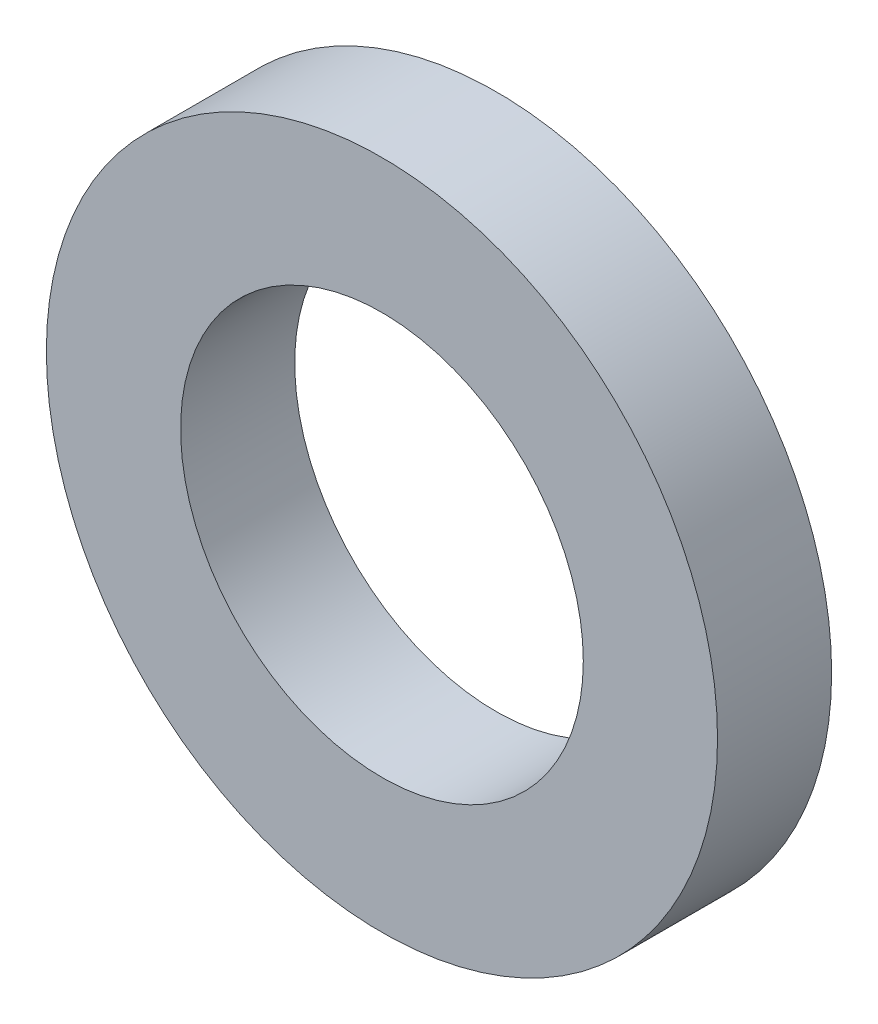
ISO-10303-21;
HEADER;
FILE_DESCRIPTION(('STEP AP214'),'2;1');
FILE_NAME('part.step','',(''),(''),'','','');
FILE_SCHEMA(('AUTOMOTIVE_DESIGN { 1 0 10303 214 1 1 1 1 }'));
ENDSEC;
DATA;
#1=APPLICATION_CONTEXT('core data for automotive mechanical design processes');
#2=APPLICATION_PROTOCOL_DEFINITION('international standard','automotive_design',2000,#1);
#3=PRODUCT_CONTEXT('',#1,'mechanical');
#4=PRODUCT('Part','Part','',(#3));
#5=PRODUCT_RELATED_PRODUCT_CATEGORY('part','',(#4));
#6=PRODUCT_DEFINITION_FORMATION('','',#4);
#7=PRODUCT_DEFINITION_CONTEXT('part definition',#1,'design');
#8=PRODUCT_DEFINITION('design','',#6,#7);
#9=PRODUCT_DEFINITION_SHAPE('','',#8);
#10=(LENGTH_UNIT() NAMED_UNIT(*) SI_UNIT(.MILLI.,.METRE.));
#11=(NAMED_UNIT(*) PLANE_ANGLE_UNIT() SI_UNIT($,.RADIAN.));
#12=(NAMED_UNIT(*) SI_UNIT($,.STERADIAN.) SOLID_ANGLE_UNIT());
#13=UNCERTAINTY_MEASURE_WITH_UNIT(LENGTH_MEASURE(1.E-05),#10,'distance_accuracy_value','');
#14=(GEOMETRIC_REPRESENTATION_CONTEXT(3) GLOBAL_UNCERTAINTY_ASSIGNED_CONTEXT((#13)) GLOBAL_UNIT_ASSIGNED_CONTEXT((#10,
#11,#12)) REPRESENTATION_CONTEXT('',''));
#15=CARTESIAN_POINT('',(0.,0.,0.));
#16=DIRECTION('',(0.,0.,1.));
#17=DIRECTION('',(1.,0.,0.));
#18=AXIS2_PLACEMENT_3D('',#15,#16,#17);
#19=CARTESIAN_POINT('',(0.,0.,1.7));
#20=DIRECTION('',(0.,0.,1.));
#21=DIRECTION('',(1.,0.,0.));
#22=AXIS2_PLACEMENT_3D('',#19,#20,#21);
#23=PLANE('',#22);
#24=CARTESIAN_POINT('',(0.,0.,1.7));
#25=DIRECTION('',(0.,0.,1.));
#26=DIRECTION('',(1.,0.,0.));
#27=AXIS2_PLACEMENT_3D('',#24,#25,#26);
#28=CIRCLE('',#27,5.);
#29=CARTESIAN_POINT('',(5.,0.,1.7));
#30=VERTEX_POINT('',#29);
#31=EDGE_CURVE('E10',#30,#30,#28,.T.);
#32=ORIENTED_EDGE('',*,*,#31,.T.);
#33=EDGE_LOOP('',(#32));
#34=FACE_BOUND('',#33,.T.);
#35=CARTESIAN_POINT('',(0.,0.,1.7));
#36=DIRECTION('',(0.,0.,1.));
#37=DIRECTION('',(1.,0.,0.));
#38=AXIS2_PLACEMENT_3D('',#35,#36,#37);
#39=CIRCLE('',#38,3.);
#40=CARTESIAN_POINT('',(3.,0.,1.7));
#41=VERTEX_POINT('',#40);
#42=EDGE_CURVE('E42',#41,#41,#39,.T.);
#43=ORIENTED_EDGE('',*,*,#42,.F.);
#44=EDGE_LOOP('',(#43));
#45=FACE_BOUND('',#44,.T.);
#46=ADVANCED_FACE('F31',(#34,#45),#23,.T.);
#47=CARTESIAN_POINT('',(0.,0.,0.));
#48=DIRECTION('',(0.,0.,1.));
#49=DIRECTION('',(1.,0.,0.));
#50=AXIS2_PLACEMENT_3D('',#47,#48,#49);
#51=PLANE('',#50);
#52=CARTESIAN_POINT('',(0.,0.,0.));
#53=DIRECTION('',(0.,0.,1.));
#54=DIRECTION('',(1.,0.,0.));
#55=AXIS2_PLACEMENT_3D('',#52,#53,#54);
#56=CIRCLE('',#55,5.);
#57=CARTESIAN_POINT('',(5.,0.,0.));
#58=VERTEX_POINT('',#57);
#59=EDGE_CURVE('E35',#58,#58,#56,.T.);
#60=ORIENTED_EDGE('',*,*,#59,.F.);
#61=EDGE_LOOP('',(#60));
#62=FACE_BOUND('',#61,.T.);
#63=CARTESIAN_POINT('',(0.,0.,0.));
#64=DIRECTION('',(0.,0.,1.));
#65=DIRECTION('',(1.,0.,0.));
#66=AXIS2_PLACEMENT_3D('',#63,#64,#65);
#67=CIRCLE('',#66,3.);
#68=CARTESIAN_POINT('',(3.,0.,0.));
#69=VERTEX_POINT('',#68);
#70=EDGE_CURVE('E44',#69,#69,#67,.T.);
#71=ORIENTED_EDGE('',*,*,#70,.T.);
#72=EDGE_LOOP('',(#71));
#73=FACE_BOUND('',#72,.T.);
#74=ADVANCED_FACE('F54',(#62,#73),#51,.F.);
#75=CARTESIAN_POINT('',(0.,0.,1.7));
#76=DIRECTION('',(0.,0.,-1.));
#77=DIRECTION('',(-1.,0.,0.));
#78=AXIS2_PLACEMENT_3D('',#75,#76,#77);
#79=CYLINDRICAL_SURFACE('',#78,5.);
#80=ORIENTED_EDGE('',*,*,#31,.F.);
#81=EDGE_LOOP('',(#80));
#82=FACE_BOUND('',#81,.T.);
#83=ORIENTED_EDGE('',*,*,#59,.T.);
#84=EDGE_LOOP('',(#83));
#85=FACE_BOUND('',#84,.T.);
#86=ADVANCED_FACE('F33',(#82,#85),#79,.T.);
#87=CARTESIAN_POINT('',(0.,0.,1.7));
#88=DIRECTION('',(0.,0.,-1.));
#89=DIRECTION('',(-1.,0.,0.));
#90=AXIS2_PLACEMENT_3D('',#87,#88,#89);
#91=CYLINDRICAL_SURFACE('',#90,3.);
#92=ORIENTED_EDGE('',*,*,#42,.T.);
#93=EDGE_LOOP('',(#92));
#94=FACE_BOUND('',#93,.T.);
#95=ORIENTED_EDGE('',*,*,#70,.F.);
#96=EDGE_LOOP('',(#95));
#97=FACE_BOUND('',#96,.T.);
#98=ADVANCED_FACE('F50',(#94,#97),#91,.F.);
#99=CLOSED_SHELL('',(#46,#74,#86,#98));
#100=MANIFOLD_SOLID_BREP('B2',#99);
#101=ADVANCED_BREP_SHAPE_REPRESENTATION('',(#18,#100),#14);
#102=SHAPE_DEFINITION_REPRESENTATION(#9,#101);
ENDSEC;
END-ISO-10303-21;
